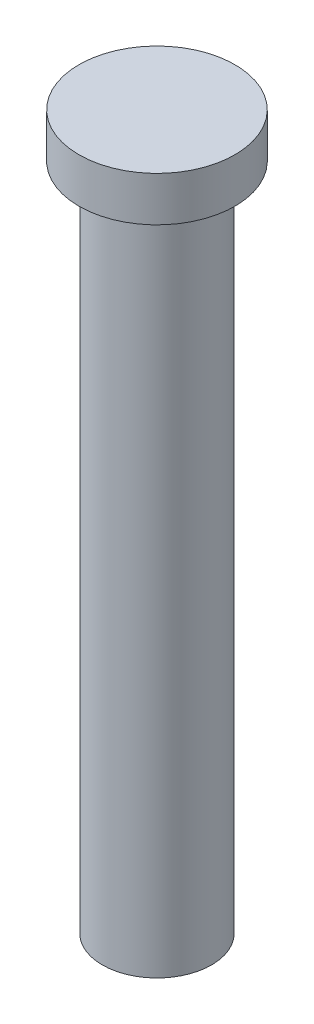
ISO-10303-21;
HEADER;
FILE_DESCRIPTION(('STEP AP214'),'2;1');
FILE_NAME('part.step','',(''),(''),'','','');
FILE_SCHEMA(('AUTOMOTIVE_DESIGN { 1 0 10303 214 1 1 1 1 }'));
ENDSEC;
DATA;
#1=APPLICATION_CONTEXT('core data for automotive mechanical design processes');
#2=APPLICATION_PROTOCOL_DEFINITION('international standard','automotive_design',2000,#1);
#3=PRODUCT_CONTEXT('',#1,'mechanical');
#4=PRODUCT('Part','Part','',(#3));
#5=PRODUCT_RELATED_PRODUCT_CATEGORY('part','',(#4));
#6=PRODUCT_DEFINITION_FORMATION('','',#4);
#7=PRODUCT_DEFINITION_CONTEXT('part definition',#1,'design');
#8=PRODUCT_DEFINITION('design','',#6,#7);
#9=PRODUCT_DEFINITION_SHAPE('','',#8);
#10=(LENGTH_UNIT() NAMED_UNIT(*) SI_UNIT(.MILLI.,.METRE.));
#11=(NAMED_UNIT(*) PLANE_ANGLE_UNIT() SI_UNIT($,.RADIAN.));
#12=(NAMED_UNIT(*) SI_UNIT($,.STERADIAN.) SOLID_ANGLE_UNIT());
#13=UNCERTAINTY_MEASURE_WITH_UNIT(LENGTH_MEASURE(1.E-05),#10,'distance_accuracy_value','');
#14=(GEOMETRIC_REPRESENTATION_CONTEXT(3) GLOBAL_UNCERTAINTY_ASSIGNED_CONTEXT((#13)) GLOBAL_UNIT_ASSIGNED_CONTEXT((#10,
#11,#12)) REPRESENTATION_CONTEXT('',''));
#15=CARTESIAN_POINT('',(0.,0.,0.));
#16=DIRECTION('',(0.,0.,1.));
#17=DIRECTION('',(1.,0.,0.));
#18=AXIS2_PLACEMENT_3D('',#15,#16,#17);
#19=CARTESIAN_POINT('',(0.,30.,0.));
#20=DIRECTION('',(0.,-1.,0.));
#21=DIRECTION('',(0.,0.,-1.));
#22=AXIS2_PLACEMENT_3D('',#19,#20,#21);
#23=CYLINDRICAL_SURFACE('',#22,2.45);
#24=CARTESIAN_POINT('',(0.,30.,0.));
#25=DIRECTION('',(0.,1.,0.));
#26=DIRECTION('',(0.,0.,1.));
#27=AXIS2_PLACEMENT_3D('',#24,#25,#26);
#28=CIRCLE('',#27,2.45);
#29=CARTESIAN_POINT('',(0.,30.,2.45));
#30=VERTEX_POINT('',#29);
#31=EDGE_CURVE('E10',#30,#30,#28,.T.);
#32=ORIENTED_EDGE('',*,*,#31,.F.);
#33=EDGE_LOOP('',(#32));
#34=FACE_BOUND('',#33,.T.);
#35=CARTESIAN_POINT('',(0.,0.,0.));
#36=DIRECTION('',(0.,1.,0.));
#37=DIRECTION('',(0.,0.,1.));
#38=AXIS2_PLACEMENT_3D('',#35,#36,#37);
#39=CIRCLE('',#38,2.45);
#40=CARTESIAN_POINT('',(0.,0.,2.45));
#41=VERTEX_POINT('',#40);
#42=EDGE_CURVE('E33',#41,#41,#39,.T.);
#43=ORIENTED_EDGE('',*,*,#42,.T.);
#44=EDGE_LOOP('',(#43));
#45=FACE_BOUND('',#44,.T.);
#46=ADVANCED_FACE('F30',(#34,#45),#23,.T.);
#47=CARTESIAN_POINT('',(0.,0.,0.));
#48=DIRECTION('',(0.,1.,0.));
#49=DIRECTION('',(0.,0.,1.));
#50=AXIS2_PLACEMENT_3D('',#47,#48,#49);
#51=PLANE('',#50);
#52=ORIENTED_EDGE('',*,*,#42,.F.);
#53=EDGE_LOOP('',(#52));
#54=FACE_BOUND('',#53,.T.);
#55=ADVANCED_FACE('F53',(#54),#51,.F.);
#56=CARTESIAN_POINT('',(0.,32.,0.));
#57=DIRECTION('',(0.,-1.,0.));
#58=DIRECTION('',(0.,0.,-1.));
#59=AXIS2_PLACEMENT_3D('',#56,#57,#58);
#60=CYLINDRICAL_SURFACE('',#59,3.5);
#61=CARTESIAN_POINT('',(0.,32.,0.));
#62=DIRECTION('',(0.,1.,0.));
#63=DIRECTION('',(0.,0.,1.));
#64=AXIS2_PLACEMENT_3D('',#61,#62,#63);
#65=CIRCLE('',#64,3.5);
#66=CARTESIAN_POINT('',(0.,32.,3.5));
#67=VERTEX_POINT('',#66);
#68=EDGE_CURVE('E40',#67,#67,#65,.T.);
#69=ORIENTED_EDGE('',*,*,#68,.F.);
#70=EDGE_LOOP('',(#69));
#71=FACE_BOUND('',#70,.T.);
#72=CARTESIAN_POINT('',(0.,30.,0.));
#73=DIRECTION('',(0.,1.,0.));
#74=DIRECTION('',(0.,0.,1.));
#75=AXIS2_PLACEMENT_3D('',#72,#73,#74);
#76=CIRCLE('',#75,3.5);
#77=CARTESIAN_POINT('',(0.,30.,3.5));
#78=VERTEX_POINT('',#77);
#79=EDGE_CURVE('E42',#78,#78,#76,.T.);
#80=ORIENTED_EDGE('',*,*,#79,.T.);
#81=EDGE_LOOP('',(#80));
#82=FACE_BOUND('',#81,.T.);
#83=ADVANCED_FACE('F50',(#71,#82),#60,.T.);
#84=CARTESIAN_POINT('',(0.,32.,0.));
#85=DIRECTION('',(0.,1.,0.));
#86=DIRECTION('',(0.,0.,1.));
#87=AXIS2_PLACEMENT_3D('',#84,#85,#86);
#88=PLANE('',#87);
#89=ORIENTED_EDGE('',*,*,#68,.T.);
#90=EDGE_LOOP('',(#89));
#91=FACE_BOUND('',#90,.T.);
#92=ADVANCED_FACE('F48',(#91),#88,.T.);
#93=CARTESIAN_POINT('',(0.,30.,0.));
#94=DIRECTION('',(0.,1.,0.));
#95=DIRECTION('',(0.,0.,1.));
#96=AXIS2_PLACEMENT_3D('',#93,#94,#95);
#97=PLANE('',#96);
#98=ORIENTED_EDGE('',*,*,#31,.T.);
#99=EDGE_LOOP('',(#98));
#100=FACE_BOUND('',#99,.T.);
#101=ORIENTED_EDGE('',*,*,#79,.F.);
#102=EDGE_LOOP('',(#101));
#103=FACE_BOUND('',#102,.T.);
#104=ADVANCED_FACE('F57',(#100,#103),#97,.F.);
#105=CLOSED_SHELL('',(#46,#55,#83,#92,#104));
#106=MANIFOLD_SOLID_BREP('B2',#105);
#107=ADVANCED_BREP_SHAPE_REPRESENTATION('',(#18,#106),#14);
#108=SHAPE_DEFINITION_REPRESENTATION(#9,#107);
ENDSEC;
END-ISO-10303-21;
